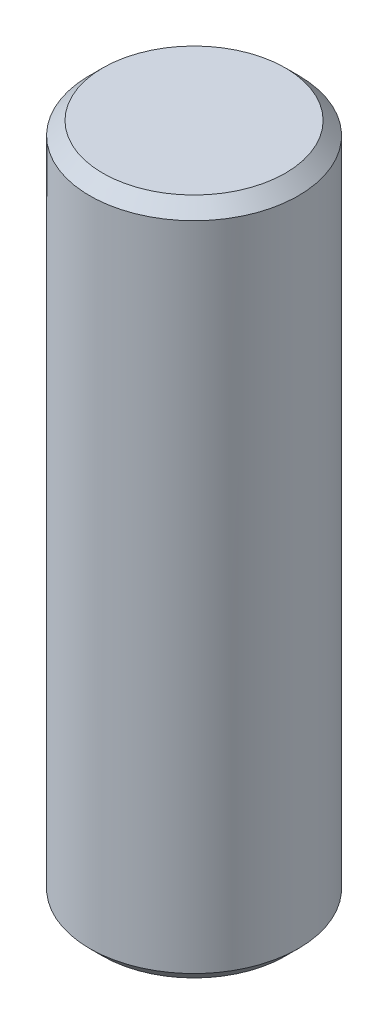
ISO-10303-21;
HEADER;
FILE_DESCRIPTION(('STEP AP214'),'2;1');
FILE_NAME('part.step','',(''),(''),'','','');
FILE_SCHEMA(('AUTOMOTIVE_DESIGN { 1 0 10303 214 1 1 1 1 }'));
ENDSEC;
DATA;
#1=APPLICATION_CONTEXT('core data for automotive mechanical design processes');
#2=APPLICATION_PROTOCOL_DEFINITION('international standard','automotive_design',2000,#1);
#3=PRODUCT_CONTEXT('',#1,'mechanical');
#4=PRODUCT('Part','Part','',(#3));
#5=PRODUCT_RELATED_PRODUCT_CATEGORY('part','',(#4));
#6=PRODUCT_DEFINITION_FORMATION('','',#4);
#7=PRODUCT_DEFINITION_CONTEXT('part definition',#1,'design');
#8=PRODUCT_DEFINITION('design','',#6,#7);
#9=PRODUCT_DEFINITION_SHAPE('','',#8);
#10=(LENGTH_UNIT() NAMED_UNIT(*) SI_UNIT(.MILLI.,.METRE.));
#11=(NAMED_UNIT(*) PLANE_ANGLE_UNIT() SI_UNIT($,.RADIAN.));
#12=(NAMED_UNIT(*) SI_UNIT($,.STERADIAN.) SOLID_ANGLE_UNIT());
#13=UNCERTAINTY_MEASURE_WITH_UNIT(LENGTH_MEASURE(1.E-05),#10,'distance_accuracy_value','');
#14=(GEOMETRIC_REPRESENTATION_CONTEXT(3) GLOBAL_UNCERTAINTY_ASSIGNED_CONTEXT((#13)) GLOBAL_UNIT_ASSIGNED_CONTEXT((#10,
#11,#12)) REPRESENTATION_CONTEXT('',''));
#15=CARTESIAN_POINT('',(0.,0.,0.));
#16=DIRECTION('',(0.,0.,1.));
#17=DIRECTION('',(1.,0.,0.));
#18=AXIS2_PLACEMENT_3D('',#15,#16,#17);
#19=CARTESIAN_POINT('',(0.,26.,0.));
#20=DIRECTION('',(0.,-1.,0.));
#21=DIRECTION('',(0.,0.,-1.));
#22=AXIS2_PLACEMENT_3D('',#19,#20,#21);
#23=CYLINDRICAL_SURFACE('',#22,8.);
#24=CARTESIAN_POINT('',(0.,-25.,0.));
#25=DIRECTION('',(0.,1.,0.));
#26=DIRECTION('',(0.,0.,1.));
#27=AXIS2_PLACEMENT_3D('',#24,#25,#26);
#28=CIRCLE('',#27,8.);
#29=CARTESIAN_POINT('',(0.,-25.,-8.));
#30=VERTEX_POINT('',#29);
#31=EDGE_CURVE('E59',#30,#30,#28,.T.);
#32=CARTESIAN_POINT('',(0.,25.,0.));
#33=DIRECTION('',(0.,1.,0.));
#34=DIRECTION('',(0.,0.,1.));
#35=AXIS2_PLACEMENT_3D('',#32,#33,#34);
#36=CIRCLE('',#35,8.);
#37=CARTESIAN_POINT('',(0.,25.,-8.));
#38=VERTEX_POINT('',#37);
#39=EDGE_CURVE('E64',#38,#38,#36,.F.);
#40=CARTESIAN_POINT('',(0.,-25.,-8.));
#41=CARTESIAN_POINT('',(0.,-24.4791666666667,-8.));
#42=CARTESIAN_POINT('',(0.,-23.9583333333333,-8.));
#43=CARTESIAN_POINT('',(0.,-22.9166666666666,-8.));
#44=CARTESIAN_POINT('',(0.,-22.3958333333333,-8.));
#45=CARTESIAN_POINT('',(0.,-21.3541666666667,-8.));
#46=CARTESIAN_POINT('',(0.,-20.8333333333333,-8.));
#47=CARTESIAN_POINT('',(0.,-19.7916666666667,-8.));
#48=CARTESIAN_POINT('',(0.,-19.2708333333333,-8.));
#49=CARTESIAN_POINT('',(0.,-18.2291666666667,-8.));
#50=CARTESIAN_POINT('',(0.,-17.7083333333333,-8.));
#51=CARTESIAN_POINT('',(0.,-16.6666666666667,-8.));
#52=CARTESIAN_POINT('',(0.,-16.1458333333333,-8.));
#53=CARTESIAN_POINT('',(0.,-15.1041666666667,-8.));
#54=CARTESIAN_POINT('',(0.,-14.5833333333333,-8.));
#55=CARTESIAN_POINT('',(0.,-13.5416666666667,-8.));
#56=CARTESIAN_POINT('',(0.,-13.0208333333333,-8.));
#57=CARTESIAN_POINT('',(0.,-11.9791666666667,-8.));
#58=CARTESIAN_POINT('',(0.,-11.4583333333333,-8.));
#59=CARTESIAN_POINT('',(0.,-10.4166666666667,-8.));
#60=CARTESIAN_POINT('',(0.,-9.89583333333332,-8.));
#61=CARTESIAN_POINT('',(0.,-8.85416666666665,-8.));
#62=CARTESIAN_POINT('',(0.,-8.33333333333332,-8.));
#63=CARTESIAN_POINT('',(0.,-7.29166666666665,-8.));
#64=CARTESIAN_POINT('',(0.,-6.77083333333332,-8.));
#65=CARTESIAN_POINT('',(0.,-5.72916666666665,-8.));
#66=CARTESIAN_POINT('',(0.,-5.20833333333332,-8.));
#67=CARTESIAN_POINT('',(0.,-4.16666666666665,-8.));
#68=CARTESIAN_POINT('',(0.,-3.64583333333332,-8.));
#69=CARTESIAN_POINT('',(0.,-2.60416666666665,-8.));
#70=CARTESIAN_POINT('',(0.,-2.08333333333332,-8.));
#71=CARTESIAN_POINT('',(0.,-1.04166666666665,-8.));
#72=CARTESIAN_POINT('',(0.,-0.52083333333332,-8.));
#73=CARTESIAN_POINT('',(0.,0.520833333333348,-8.));
#74=CARTESIAN_POINT('',(0.,1.04166666666668,-8.));
#75=CARTESIAN_POINT('',(0.,2.08333333333335,-8.));
#76=CARTESIAN_POINT('',(0.,2.60416666666668,-8.));
#77=CARTESIAN_POINT('',(0.,3.64583333333335,-8.));
#78=CARTESIAN_POINT('',(0.,4.16666666666668,-8.));
#79=CARTESIAN_POINT('',(0.,5.20833333333335,-8.));
#80=CARTESIAN_POINT('',(0.,5.72916666666668,-8.));
#81=CARTESIAN_POINT('',(0.,6.77083333333335,-8.));
#82=CARTESIAN_POINT('',(0.,7.29166666666668,-8.));
#83=CARTESIAN_POINT('',(0.,8.33333333333335,-8.));
#84=CARTESIAN_POINT('',(0.,8.85416666666668,-8.));
#85=CARTESIAN_POINT('',(0.,9.89583333333335,-8.));
#86=CARTESIAN_POINT('',(0.,10.4166666666667,-8.));
#87=CARTESIAN_POINT('',(0.,11.4583333333333,-8.));
#88=CARTESIAN_POINT('',(0.,11.9791666666667,-8.));
#89=CARTESIAN_POINT('',(0.,13.0208333333333,-8.));
#90=CARTESIAN_POINT('',(0.,13.5416666666667,-8.));
#91=CARTESIAN_POINT('',(0.,14.5833333333333,-8.));
#92=CARTESIAN_POINT('',(0.,15.1041666666667,-8.));
#93=CARTESIAN_POINT('',(0.,16.1458333333333,-8.));
#94=CARTESIAN_POINT('',(0.,16.6666666666667,-8.));
#95=CARTESIAN_POINT('',(0.,17.7083333333333,-8.));
#96=CARTESIAN_POINT('',(0.,18.2291666666667,-8.));
#97=CARTESIAN_POINT('',(0.,19.2708333333333,-8.));
#98=CARTESIAN_POINT('',(0.,19.7916666666667,-8.));
#99=CARTESIAN_POINT('',(0.,20.8333333333333,-8.));
#100=CARTESIAN_POINT('',(0.,21.3541666666667,-8.));
#101=CARTESIAN_POINT('',(0.,22.3958333333333,-8.));
#102=CARTESIAN_POINT('',(0.,22.9166666666667,-8.));
#103=CARTESIAN_POINT('',(0.,23.9583333333333,-8.));
#104=CARTESIAN_POINT('',(0.,24.4791666666667,-8.));
#105=CARTESIAN_POINT('',(0.,25.,-8.));
#106=B_SPLINE_CURVE_WITH_KNOTS('',3,(#40,#41,#42,#43,#44,#45,#46,#47,#48,#49,#50,#51,#52,#53,
#54,#55,#56,#57,#58,#59,#60,#61,#62,#63,#64,#65,#66,#67,#68,#69,#70,#71,#72,#73,#74,#75,#76,#77,
#78,#79,#80,#81,#82,#83,#84,#85,#86,#87,#88,#89,#90,#91,#92,#93,#94,#95,#96,#97,#98,#99,#100,
#101,#102,#103,#104,#105),.UNSPECIFIED.,.F.,.F.,(4,2,2,2,2,2,2,2,2,2,2,2,2,2,2,2,2,2,2,2,2,2,2,
2,2,2,2,2,2,2,2,2,4),(0.,1.5625,3.125,4.6875,6.25,7.8125,9.375,10.9375,12.5,14.0625,15.625,
17.1875,18.75,20.3125,21.875,23.4375,25.,26.5625,28.125,29.6875,31.25,32.8125,34.375,35.9375,
37.5,39.0625,40.625,42.1875,43.75,45.3125,46.875,48.4375,50.),.UNSPECIFIED.);
#107=EDGE_CURVE('BSEAM45',#30,#38,#106,.T.);
#108=ORIENTED_EDGE('',*,*,#31,.T.);
#109=ORIENTED_EDGE('',*,*,#39,.T.);
#110=ORIENTED_EDGE('',*,*,#107,.T.);
#111=ORIENTED_EDGE('',*,*,#107,.F.);
#112=EDGE_LOOP('',(#108,#110,#109,#111));
#113=FACE_BOUND('',#112,.T.);
#114=ADVANCED_FACE('F45',(#113),#23,.T.);
#115=CARTESIAN_POINT('',(0.,26.,0.));
#116=DIRECTION('',(0.,1.,0.));
#117=DIRECTION('',(0.,0.,1.));
#118=AXIS2_PLACEMENT_3D('',#115,#116,#117);
#119=PLANE('',#118);
#120=CARTESIAN_POINT('',(0.,26.,0.));
#121=DIRECTION('',(0.,1.,0.));
#122=DIRECTION('',(0.,0.,1.));
#123=AXIS2_PLACEMENT_3D('',#120,#121,#122);
#124=CIRCLE('',#123,7.00000000000002);
#125=CARTESIAN_POINT('',(0.,26.,7.00000000000002));
#126=VERTEX_POINT('',#125);
#127=EDGE_CURVE('E10',#126,#126,#124,.T.);
#128=ORIENTED_EDGE('',*,*,#127,.T.);
#129=EDGE_LOOP('',(#128));
#130=FACE_BOUND('',#129,.T.);
#131=ADVANCED_FACE('F81',(#130),#119,.T.);
#132=CARTESIAN_POINT('',(0.,-26.,0.));
#133=DIRECTION('',(0.,1.,0.));
#134=DIRECTION('',(0.,0.,1.));
#135=AXIS2_PLACEMENT_3D('',#132,#133,#134);
#136=PLANE('',#135);
#137=CARTESIAN_POINT('',(0.,-26.,0.));
#138=DIRECTION('',(0.,1.,0.));
#139=DIRECTION('',(0.,0.,1.));
#140=AXIS2_PLACEMENT_3D('',#137,#138,#139);
#141=CIRCLE('',#140,6.99999999999996);
#142=CARTESIAN_POINT('',(0.,-26.,6.99999999999996));
#143=VERTEX_POINT('',#142);
#144=EDGE_CURVE('E54',#143,#143,#141,.F.);
#145=ORIENTED_EDGE('',*,*,#144,.T.);
#146=EDGE_LOOP('',(#145));
#147=FACE_BOUND('',#146,.T.);
#148=ADVANCED_FACE('F78',(#147),#136,.F.);
#149=CARTESIAN_POINT('',(0.,-25.,0.));
#150=DIRECTION('',(0.,1.,0.));
#151=DIRECTION('',(0.,0.,1.));
#152=AXIS2_PLACEMENT_3D('',#149,#150,#151);
#153=CONICAL_SURFACE('',#152,8.,0.785398163397455);
#154=ORIENTED_EDGE('',*,*,#144,.F.);
#155=EDGE_LOOP('',(#154));
#156=FACE_BOUND('',#155,.T.);
#157=ORIENTED_EDGE('',*,*,#31,.F.);
#158=EDGE_LOOP('',(#157));
#159=FACE_BOUND('',#158,.T.);
#160=ADVANCED_FACE('F74',(#156,#159),#153,.T.);
#161=CARTESIAN_POINT('',(0.,26.,0.));
#162=DIRECTION('',(0.,-1.,0.));
#163=DIRECTION('',(0.,0.,-1.));
#164=AXIS2_PLACEMENT_3D('',#161,#162,#163);
#165=CONICAL_SURFACE('',#164,7.00000000000002,0.785398163397443);
#166=ORIENTED_EDGE('',*,*,#39,.F.);
#167=EDGE_LOOP('',(#166));
#168=FACE_BOUND('',#167,.T.);
#169=ORIENTED_EDGE('',*,*,#127,.F.);
#170=EDGE_LOOP('',(#169));
#171=FACE_BOUND('',#170,.T.);
#172=ADVANCED_FACE('F48',(#168,#171),#165,.T.);
#173=CLOSED_SHELL('',(#114,#131,#148,#160,#172));
#174=MANIFOLD_SOLID_BREP('B2',#173);
#175=ADVANCED_BREP_SHAPE_REPRESENTATION('',(#18,#174),#14);
#176=SHAPE_DEFINITION_REPRESENTATION(#9,#175);
ENDSEC;
END-ISO-10303-21;
